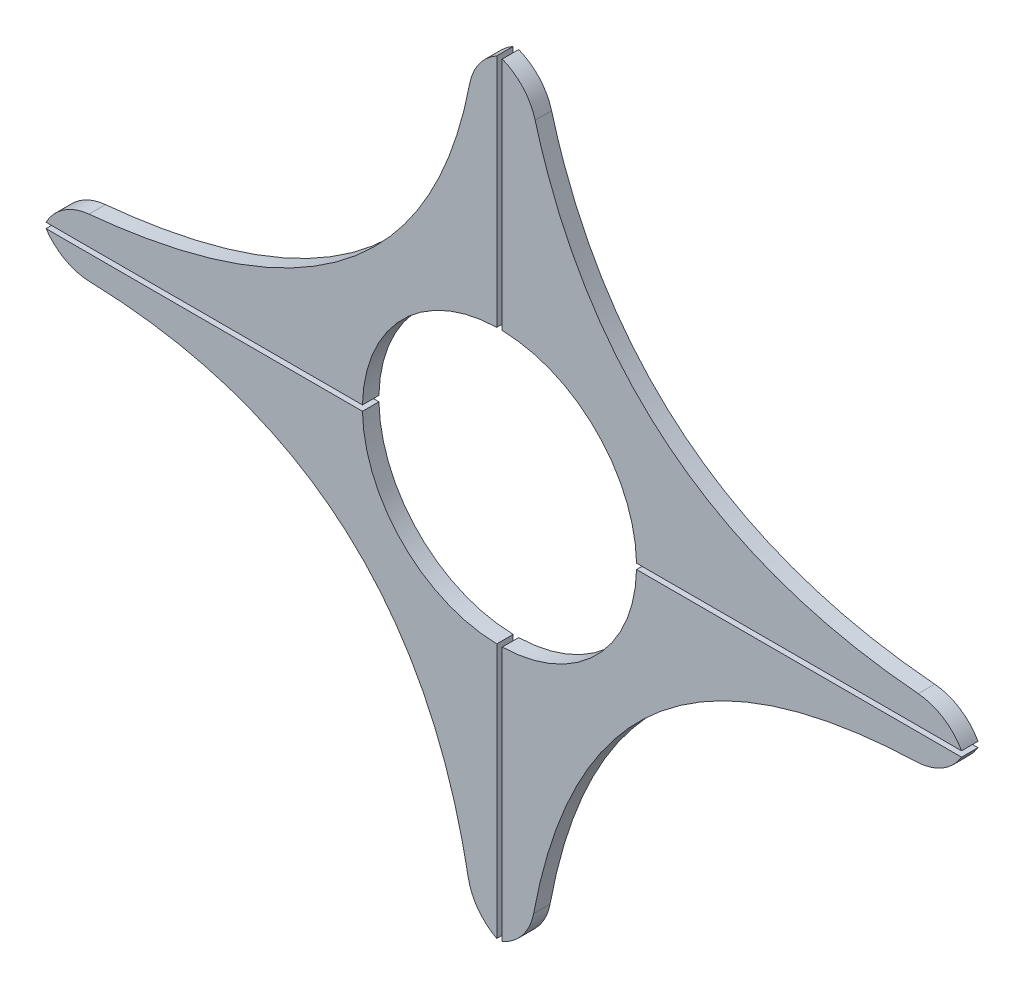
ISO-10303-21;
HEADER;
FILE_DESCRIPTION(('STEP AP214'),'2;1');
FILE_NAME('part.step','',(''),(''),'','','');
FILE_SCHEMA(('AUTOMOTIVE_DESIGN { 1 0 10303 214 1 1 1 1 }'));
ENDSEC;
DATA;
#1=APPLICATION_CONTEXT('core data for automotive mechanical design processes');
#2=APPLICATION_PROTOCOL_DEFINITION('international standard','automotive_design',2000,#1);
#3=PRODUCT_CONTEXT('',#1,'mechanical');
#4=PRODUCT('Part','Part','',(#3));
#5=PRODUCT_RELATED_PRODUCT_CATEGORY('part','',(#4));
#6=PRODUCT_DEFINITION_FORMATION('','',#4);
#7=PRODUCT_DEFINITION_CONTEXT('part definition',#1,'design');
#8=PRODUCT_DEFINITION('design','',#6,#7);
#9=PRODUCT_DEFINITION_SHAPE('','',#8);
#10=(LENGTH_UNIT() NAMED_UNIT(*) SI_UNIT(.MILLI.,.METRE.));
#11=(NAMED_UNIT(*) PLANE_ANGLE_UNIT() SI_UNIT($,.RADIAN.));
#12=(NAMED_UNIT(*) SI_UNIT($,.STERADIAN.) SOLID_ANGLE_UNIT());
#13=UNCERTAINTY_MEASURE_WITH_UNIT(LENGTH_MEASURE(1.E-05),#10,'distance_accuracy_value','');
#14=(GEOMETRIC_REPRESENTATION_CONTEXT(3) GLOBAL_UNCERTAINTY_ASSIGNED_CONTEXT((#13)) GLOBAL_UNIT_ASSIGNED_CONTEXT((#10,
#11,#12)) REPRESENTATION_CONTEXT('',''));
#15=CARTESIAN_POINT('',(0.,0.,0.));
#16=DIRECTION('',(0.,0.,1.));
#17=DIRECTION('',(1.,0.,0.));
#18=AXIS2_PLACEMENT_3D('',#15,#16,#17);
#19=CARTESIAN_POINT('',(0.,0.,3.));
#20=DIRECTION('',(0.,0.,-1.));
#21=DIRECTION('',(-1.,0.,0.));
#22=AXIS2_PLACEMENT_3D('',#19,#20,#21);
#23=PLANE('',#22);
#24=CARTESIAN_POINT('',(-82.7092824955107,-4.92806949824712,3.));
#25=CARTESIAN_POINT('',(-13.547108576695,-2.57847969047096,3.));
#26=CARTESIAN_POINT('',(-4.58970768660391,-71.5253229127844,3.));
#27=B_SPLINE_CURVE_WITH_KNOTS('',2,(#24,#25,#26),.UNSPECIFIED.,.F.,.F.,(3,3),(0.,1.),.UNSPECIFIED.);
#28=CARTESIAN_POINT('',(-74.7083842259428,-4.9004073755603,3.));
#29=VERTEX_POINT('',#28);
#30=CARTESIAN_POINT('',(-5.6943858931049,-64.4920395339686,3.));
#31=VERTEX_POINT('',#30);
#32=EDGE_CURVE('E105',#29,#31,#27,.T.);
#33=ORIENTED_EDGE('',*,*,#32,.T.);
#34=CARTESIAN_POINT('',(4.13740786350712,-62.6656136451231,3.));
#35=DIRECTION('',(0.,0.,-1.));
#36=DIRECTION('',(-1.,0.,0.));
#37=AXIS2_PLACEMENT_3D('',#34,#35,#36);
#38=CIRCLE('',#37,10.);
#39=CARTESIAN_POINT('',(-0.5,-71.5253229127844,3.));
#40=VERTEX_POINT('',#39);
#41=EDGE_CURVE('E12',#31,#40,#38,.F.);
#42=ORIENTED_EDGE('',*,*,#41,.T.);
#43=DIRECTION('',(0.,1.,0.));
#44=VECTOR('',#43,1.);
#45=CARTESIAN_POINT('',(-0.5,-80.8885192781486,3.));
#46=LINE('',#45,#44);
#47=CARTESIAN_POINT('',(-0.5,-24.9949994999,3.));
#48=VERTEX_POINT('',#47);
#49=EDGE_CURVE('E103',#40,#48,#46,.T.);
#50=ORIENTED_EDGE('',*,*,#49,.T.);
#51=CARTESIAN_POINT('',(0.,0.,3.));
#52=DIRECTION('',(0.,0.,1.));
#53=DIRECTION('',(1.,0.,0.));
#54=AXIS2_PLACEMENT_3D('',#51,#52,#53);
#55=CIRCLE('',#54,25.);
#56=CARTESIAN_POINT('',(-24.9949994999,-0.5,3.));
#57=VERTEX_POINT('',#56);
#58=EDGE_CURVE('E139',#57,#48,#55,.T.);
#59=ORIENTED_EDGE('',*,*,#58,.F.);
#60=DIRECTION('',(-1.,0.,0.));
#61=VECTOR('',#60,1.);
#62=CARTESIAN_POINT('',(0.,-0.5,3.));
#63=LINE('',#62,#61);
#64=CARTESIAN_POINT('',(-82.7092824955107,-0.5,3.));
#65=VERTEX_POINT('',#64);
#66=EDGE_CURVE('E114',#57,#65,#63,.T.);
#67=ORIENTED_EDGE('',*,*,#66,.T.);
#68=CARTESIAN_POINT('',(-74.4212968329592,5.09547081641413,3.));
#69=DIRECTION('',(0.,0.,-1.));
#70=DIRECTION('',(-1.,0.,0.));
#71=AXIS2_PLACEMENT_3D('',#68,#69,#70);
#72=CIRCLE('',#71,10.);
#73=EDGE_CURVE('E150',#65,#29,#72,.F.);
#74=ORIENTED_EDGE('',*,*,#73,.T.);
#75=EDGE_LOOP('',(#33,#42,#50,#59,#67,#74));
#76=FACE_BOUND('',#75,.T.);
#77=ADVANCED_FACE('F48',(#76),#23,.F.);
#78=CARTESIAN_POINT('',(0.,0.,0.));
#79=DIRECTION('',(0.,0.,-1.));
#80=DIRECTION('',(-1.,0.,0.));
#81=AXIS2_PLACEMENT_3D('',#78,#79,#80);
#82=PLANE('',#81);
#83=DIRECTION('',(0.,1.,0.));
#84=VECTOR('',#83,1.);
#85=CARTESIAN_POINT('',(-0.5,-80.8885192781486,0.));
#86=LINE('',#85,#84);
#87=CARTESIAN_POINT('',(-0.5,-71.5253229127844,0.));
#88=VERTEX_POINT('',#87);
#89=CARTESIAN_POINT('',(-0.5,-24.9949994999,0.));
#90=VERTEX_POINT('',#89);
#91=EDGE_CURVE('E134',#88,#90,#86,.T.);
#92=ORIENTED_EDGE('',*,*,#91,.F.);
#93=CARTESIAN_POINT('',(4.13740786350712,-62.6656136451231,0.));
#94=DIRECTION('',(0.,0.,-1.));
#95=DIRECTION('',(-1.,0.,0.));
#96=AXIS2_PLACEMENT_3D('',#93,#94,#95);
#97=CIRCLE('',#96,10.);
#98=CARTESIAN_POINT('',(-5.6943858931049,-64.4920395339686,0.));
#99=VERTEX_POINT('',#98);
#100=EDGE_CURVE('E70',#88,#99,#97,.T.);
#101=ORIENTED_EDGE('',*,*,#100,.T.);
#102=CARTESIAN_POINT('',(-82.7092824955107,-4.92806949824712,0.));
#103=CARTESIAN_POINT('',(-13.547108576695,-2.57847969047096,0.));
#104=CARTESIAN_POINT('',(-4.58970768660391,-71.5253229127844,0.));
#105=B_SPLINE_CURVE_WITH_KNOTS('',2,(#102,#103,#104),.UNSPECIFIED.,.F.,.F.,(3,3),(0.,1.),.UNSPECIFIED.);
#106=CARTESIAN_POINT('',(-74.7083842259428,-4.9004073755603,0.));
#107=VERTEX_POINT('',#106);
#108=EDGE_CURVE('E126',#107,#99,#105,.T.);
#109=ORIENTED_EDGE('',*,*,#108,.F.);
#110=CARTESIAN_POINT('',(-74.4212968329592,5.09547081641413,0.));
#111=DIRECTION('',(0.,0.,-1.));
#112=DIRECTION('',(-1.,0.,0.));
#113=AXIS2_PLACEMENT_3D('',#110,#111,#112);
#114=CIRCLE('',#113,10.);
#115=CARTESIAN_POINT('',(-82.7092824955107,-0.5,0.));
#116=VERTEX_POINT('',#115);
#117=EDGE_CURVE('E148',#107,#116,#114,.T.);
#118=ORIENTED_EDGE('',*,*,#117,.T.);
#119=DIRECTION('',(-1.,0.,0.));
#120=VECTOR('',#119,1.);
#121=CARTESIAN_POINT('',(0.,-0.5,0.));
#122=LINE('',#121,#120);
#123=CARTESIAN_POINT('',(-24.9949994999,-0.5,0.));
#124=VERTEX_POINT('',#123);
#125=EDGE_CURVE('E120',#124,#116,#122,.T.);
#126=ORIENTED_EDGE('',*,*,#125,.F.);
#127=CARTESIAN_POINT('',(0.,0.,0.));
#128=DIRECTION('',(0.,0.,1.));
#129=DIRECTION('',(1.,0.,0.));
#130=AXIS2_PLACEMENT_3D('',#127,#128,#129);
#131=CIRCLE('',#130,25.);
#132=EDGE_CURVE('E132',#124,#90,#131,.T.);
#133=ORIENTED_EDGE('',*,*,#132,.T.);
#134=EDGE_LOOP('',(#92,#101,#109,#118,#126,#133));
#135=FACE_BOUND('',#134,.T.);
#136=ADVANCED_FACE('F158',(#135),#82,.T.);
#137=CARTESIAN_POINT('',(0.,0.,0.));
#138=DIRECTION('',(0.,0.,1.));
#139=DIRECTION('',(1.,0.,0.));
#140=AXIS2_PLACEMENT_3D('',#137,#138,#139);
#141=CYLINDRICAL_SURFACE('',#140,25.);
#142=ORIENTED_EDGE('',*,*,#58,.T.);
#143=DIRECTION('',(0.,0.,1.));
#144=VECTOR('',#143,1.);
#145=CARTESIAN_POINT('',(-0.5,-24.9949994999,0.));
#146=LINE('',#145,#144);
#147=EDGE_CURVE('E113',#48,#90,#146,.F.);
#148=ORIENTED_EDGE('',*,*,#147,.T.);
#149=ORIENTED_EDGE('',*,*,#132,.F.);
#150=DIRECTION('',(0.,0.,1.));
#151=VECTOR('',#150,1.);
#152=CARTESIAN_POINT('',(-24.9949994999,-0.5,0.));
#153=LINE('',#152,#151);
#154=EDGE_CURVE('E117',#124,#57,#153,.T.);
#155=ORIENTED_EDGE('',*,*,#154,.T.);
#156=EDGE_LOOP('',(#142,#148,#149,#155));
#157=FACE_BOUND('',#156,.T.);
#158=ADVANCED_FACE('F163',(#157),#141,.F.);
#159=CARTESIAN_POINT('',(0.,-0.5,3.));
#160=DIRECTION('',(0.,-1.,0.));
#161=DIRECTION('',(0.,0.,-1.));
#162=AXIS2_PLACEMENT_3D('',#159,#160,#161);
#163=PLANE('',#162);
#164=ORIENTED_EDGE('',*,*,#125,.T.);
#165=DIRECTION('',(0.,0.,-1.));
#166=VECTOR('',#165,1.);
#167=CARTESIAN_POINT('',(-82.7092824955107,-0.5,3.));
#168=LINE('',#167,#166);
#169=EDGE_CURVE('E116',#65,#116,#168,.T.);
#170=ORIENTED_EDGE('',*,*,#169,.F.);
#171=ORIENTED_EDGE('',*,*,#66,.F.);
#172=ORIENTED_EDGE('',*,*,#154,.F.);
#173=EDGE_LOOP('',(#164,#170,#171,#172));
#174=FACE_BOUND('',#173,.T.);
#175=ADVANCED_FACE('F161',(#174),#163,.F.);
#176=CARTESIAN_POINT('',(-0.5,-80.8885192781486,3.));
#177=DIRECTION('',(-1.,0.,0.));
#178=DIRECTION('',(0.,0.,1.));
#179=AXIS2_PLACEMENT_3D('',#176,#177,#178);
#180=PLANE('',#179);
#181=ORIENTED_EDGE('',*,*,#49,.F.);
#182=DIRECTION('',(0.,0.,1.));
#183=VECTOR('',#182,1.);
#184=CARTESIAN_POINT('',(-0.5,-71.5253229127844,3.));
#185=LINE('',#184,#183);
#186=EDGE_CURVE('E111',#88,#40,#185,.T.);
#187=ORIENTED_EDGE('',*,*,#186,.F.);
#188=ORIENTED_EDGE('',*,*,#91,.T.);
#189=ORIENTED_EDGE('',*,*,#147,.F.);
#190=EDGE_LOOP('',(#181,#187,#188,#189));
#191=FACE_BOUND('',#190,.T.);
#192=ADVANCED_FACE('F110',(#191),#180,.F.);
#193=DIRECTION('',(0.,0.,-1.));
#194=VECTOR('',#193,1.);
#195=SURFACE_OF_LINEAR_EXTRUSION('',#27,#194);
#196=ORIENTED_EDGE('',*,*,#108,.T.);
#197=DIRECTION('',(0.,0.,-1.));
#198=VECTOR('',#197,1.);
#199=CARTESIAN_POINT('',(-5.6943858931049,-64.4920395339686,0.));
#200=LINE('',#199,#198);
#201=EDGE_CURVE('E56',#99,#31,#200,.F.);
#202=ORIENTED_EDGE('',*,*,#201,.T.);
#203=ORIENTED_EDGE('',*,*,#32,.F.);
#204=DIRECTION('',(0.,0.,-1.));
#205=VECTOR('',#204,1.);
#206=CARTESIAN_POINT('',(-74.7083842259427,-4.9004073755603,3.));
#207=LINE('',#206,#205);
#208=EDGE_CURVE('E145',#29,#107,#207,.T.);
#209=ORIENTED_EDGE('',*,*,#208,.T.);
#210=EDGE_LOOP('',(#196,#202,#203,#209));
#211=FACE_BOUND('',#210,.T.);
#212=ADVANCED_FACE('F155',(#211),#195,.F.);
#213=CARTESIAN_POINT('',(-74.4212968329592,5.09547081641413,1.5));
#214=DIRECTION('',(0.,0.,-1.));
#215=DIRECTION('',(-1.,0.,0.));
#216=AXIS2_PLACEMENT_3D('',#213,#214,#215);
#217=CYLINDRICAL_SURFACE('',#216,10.);
#218=ORIENTED_EDGE('',*,*,#73,.F.);
#219=ORIENTED_EDGE('',*,*,#169,.T.);
#220=ORIENTED_EDGE('',*,*,#117,.F.);
#221=ORIENTED_EDGE('',*,*,#208,.F.);
#222=EDGE_LOOP('',(#218,#219,#220,#221));
#223=FACE_BOUND('',#222,.T.);
#224=ADVANCED_FACE('F156',(#223),#217,.T.);
#225=CARTESIAN_POINT('',(4.13740786350712,-62.6656136451231,1.5));
#226=DIRECTION('',(0.,0.,-1.));
#227=DIRECTION('',(-1.,0.,0.));
#228=AXIS2_PLACEMENT_3D('',#225,#226,#227);
#229=CYLINDRICAL_SURFACE('',#228,10.);
#230=ORIENTED_EDGE('',*,*,#41,.F.);
#231=ORIENTED_EDGE('',*,*,#201,.F.);
#232=ORIENTED_EDGE('',*,*,#100,.F.);
#233=ORIENTED_EDGE('',*,*,#186,.T.);
#234=EDGE_LOOP('',(#230,#231,#232,#233));
#235=FACE_BOUND('',#234,.T.);
#236=ADVANCED_FACE('F50',(#235),#229,.T.);
#237=CLOSED_SHELL('',(#77,#136,#158,#175,#192,#212,#224,#236));
#238=MANIFOLD_SOLID_BREP('B2',#237);
#239=CARTESIAN_POINT('',(24.9949994999,-0.5,0.));
#240=DIRECTION('',(0.,-1.,0.));
#241=DIRECTION('',(1.,0.,0.));
#242=AXIS2_PLACEMENT_3D('',#239,#240,#241);
#243=PLANE('',#242);
#244=DIRECTION('',(1.,0.,0.));
#245=VECTOR('',#244,1.);
#246=CARTESIAN_POINT('',(24.9949994999,-0.5,3.));
#247=LINE('',#246,#245);
#248=CARTESIAN_POINT('',(24.9949994999,-0.5,3.));
#249=VERTEX_POINT('',#248);
#250=CARTESIAN_POINT('',(84.269834995426,-0.5,3.));
#251=VERTEX_POINT('',#250);
#252=EDGE_CURVE('E340',#249,#251,#247,.T.);
#253=ORIENTED_EDGE('',*,*,#252,.T.);
#254=DIRECTION('',(0.,0.,1.));
#255=VECTOR('',#254,1.);
#256=CARTESIAN_POINT('',(84.269834995426,-0.5,0.));
#257=LINE('',#256,#255);
#258=CARTESIAN_POINT('',(84.269834995426,-0.5,0.));
#259=VERTEX_POINT('',#258);
#260=EDGE_CURVE('E343',#259,#251,#257,.T.);
#261=ORIENTED_EDGE('',*,*,#260,.F.);
#262=DIRECTION('',(1.,0.,0.));
#263=VECTOR('',#262,1.);
#264=CARTESIAN_POINT('',(24.9949994999,-0.5,0.));
#265=LINE('',#264,#263);
#266=CARTESIAN_POINT('',(24.9949994999,-0.500000000000074,0.));
#267=VERTEX_POINT('',#266);
#268=EDGE_CURVE('E323',#267,#259,#265,.T.);
#269=ORIENTED_EDGE('',*,*,#268,.F.);
#270=DIRECTION('',(0.,0.,1.));
#271=VECTOR('',#270,1.);
#272=CARTESIAN_POINT('',(24.9949994999,-0.5,0.));
#273=LINE('',#272,#271);
#274=EDGE_CURVE('E322',#267,#249,#273,.T.);
#275=ORIENTED_EDGE('',*,*,#274,.T.);
#276=EDGE_LOOP('',(#253,#261,#269,#275));
#277=FACE_BOUND('',#276,.T.);
#278=ADVANCED_FACE('F249',(#277),#243,.F.);
#279=CARTESIAN_POINT('',(0.,0.,0.));
#280=DIRECTION('',(0.,0.,1.));
#281=DIRECTION('',(1.,0.,0.));
#282=AXIS2_PLACEMENT_3D('',#279,#280,#281);
#283=CYLINDRICAL_SURFACE('',#282,25.);
#284=CARTESIAN_POINT('',(0.,0.,0.));
#285=DIRECTION('',(0.,0.,1.));
#286=DIRECTION('',(1.,0.,0.));
#287=AXIS2_PLACEMENT_3D('',#284,#285,#286);
#288=CIRCLE('',#287,25.);
#289=CARTESIAN_POINT('',(0.499999999999997,-24.9949994999,0.));
#290=VERTEX_POINT('',#289);
#291=EDGE_CURVE('E312',#290,#267,#288,.T.);
#292=ORIENTED_EDGE('',*,*,#291,.F.);
#293=DIRECTION('',(0.,0.,1.));
#294=VECTOR('',#293,1.);
#295=CARTESIAN_POINT('',(0.499999999999997,-24.9949994999,0.));
#296=LINE('',#295,#294);
#297=CARTESIAN_POINT('',(0.499999999999997,-24.9949994999,3.));
#298=VERTEX_POINT('',#297);
#299=EDGE_CURVE('E302',#290,#298,#296,.T.);
#300=ORIENTED_EDGE('',*,*,#299,.T.);
#301=CARTESIAN_POINT('',(0.,0.,3.));
#302=DIRECTION('',(0.,0.,1.));
#303=DIRECTION('',(1.,0.,0.));
#304=AXIS2_PLACEMENT_3D('',#301,#302,#303);
#305=CIRCLE('',#304,25.);
#306=EDGE_CURVE('E325',#298,#249,#305,.T.);
#307=ORIENTED_EDGE('',*,*,#306,.T.);
#308=ORIENTED_EDGE('',*,*,#274,.F.);
#309=EDGE_LOOP('',(#292,#300,#307,#308));
#310=FACE_BOUND('',#309,.T.);
#311=ADVANCED_FACE('F320',(#310),#283,.F.);
#312=CARTESIAN_POINT('',(0.,0.,0.));
#313=DIRECTION('',(0.,0.,-1.));
#314=DIRECTION('',(-1.,0.,0.));
#315=AXIS2_PLACEMENT_3D('',#312,#313,#314);
#316=PLANE('',#315);
#317=ORIENTED_EDGE('',*,*,#268,.T.);
#318=CARTESIAN_POINT('',(75.6950934816593,4.64527044693371,0.));
#319=DIRECTION('',(0.,0.,-1.));
#320=DIRECTION('',(-1.,0.,0.));
#321=AXIS2_PLACEMENT_3D('',#318,#319,#320);
#322=CIRCLE('',#321,10.);
#323=CARTESIAN_POINT('',(76.0302979673029,-5.3491098716656,0.));
#324=VERTEX_POINT('',#323);
#325=EDGE_CURVE('E271',#259,#324,#322,.T.);
#326=ORIENTED_EDGE('',*,*,#325,.T.);
#327=CARTESIAN_POINT('',(5.09505954304754,-71.5253229127844,0.));
#328=CARTESIAN_POINT('',(13.6112955337211,-3.3789517058772,0.));
#329=CARTESIAN_POINT('',(84.269834995426,-5.33160146614925,0.));
#330=B_SPLINE_CURVE_WITH_KNOTS('',2,(#327,#328,#329),.UNSPECIFIED.,.F.,.F.,(3,3),(0.,1.),.UNSPECIFIED.);
#331=CARTESIAN_POINT('',(6.22098603170053,-64.2350231153593,0.));
#332=VERTEX_POINT('',#331);
#333=EDGE_CURVE('E350',#332,#324,#330,.T.);
#334=ORIENTED_EDGE('',*,*,#333,.F.);
#335=CARTESIAN_POINT('',(-3.61095700379703,-62.4094009894168,0.));
#336=DIRECTION('',(0.,0.,-1.));
#337=DIRECTION('',(-1.,0.,0.));
#338=AXIS2_PLACEMENT_3D('',#335,#336,#337);
#339=CIRCLE('',#338,10.);
#340=CARTESIAN_POINT('',(0.5,-71.5253229127844,0.));
#341=VERTEX_POINT('',#340);
#342=EDGE_CURVE('E316',#332,#341,#339,.T.);
#343=ORIENTED_EDGE('',*,*,#342,.T.);
#344=DIRECTION('',(0.,-1.,0.));
#345=VECTOR('',#344,1.);
#346=CARTESIAN_POINT('',(0.5,0.,0.));
#347=LINE('',#346,#345);
#348=EDGE_CURVE('E305',#290,#341,#347,.T.);
#349=ORIENTED_EDGE('',*,*,#348,.F.);
#350=ORIENTED_EDGE('',*,*,#291,.T.);
#351=EDGE_LOOP('',(#317,#326,#334,#343,#349,#350));
#352=FACE_BOUND('',#351,.T.);
#353=ADVANCED_FACE('F314',(#352),#316,.T.);
#354=CARTESIAN_POINT('',(0.,0.,3.));
#355=DIRECTION('',(0.,0.,-1.));
#356=DIRECTION('',(-1.,0.,0.));
#357=AXIS2_PLACEMENT_3D('',#354,#355,#356);
#358=PLANE('',#357);
#359=CARTESIAN_POINT('',(5.09505954304754,-71.5253229127844,3.));
#360=CARTESIAN_POINT('',(13.6112955337211,-3.3789517058772,3.));
#361=CARTESIAN_POINT('',(84.269834995426,-5.33160146614925,3.));
#362=B_SPLINE_CURVE_WITH_KNOTS('',2,(#359,#360,#361),.UNSPECIFIED.,.F.,.F.,(3,3),(0.,1.),.UNSPECIFIED.);
#363=CARTESIAN_POINT('',(6.22098603170053,-64.2350231153593,3.));
#364=VERTEX_POINT('',#363);
#365=CARTESIAN_POINT('',(76.0302979673029,-5.3491098716656,3.));
#366=VERTEX_POINT('',#365);
#367=EDGE_CURVE('E317',#364,#366,#362,.T.);
#368=ORIENTED_EDGE('',*,*,#367,.T.);
#369=CARTESIAN_POINT('',(75.6950934816593,4.64527044693371,3.));
#370=DIRECTION('',(0.,0.,-1.));
#371=DIRECTION('',(-1.,0.,0.));
#372=AXIS2_PLACEMENT_3D('',#369,#370,#371);
#373=CIRCLE('',#372,10.);
#374=EDGE_CURVE('E46',#366,#251,#373,.F.);
#375=ORIENTED_EDGE('',*,*,#374,.T.);
#376=ORIENTED_EDGE('',*,*,#252,.F.);
#377=ORIENTED_EDGE('',*,*,#306,.F.);
#378=DIRECTION('',(0.,-1.,0.));
#379=VECTOR('',#378,1.);
#380=CARTESIAN_POINT('',(0.5,0.,3.));
#381=LINE('',#380,#379);
#382=CARTESIAN_POINT('',(0.499999999999991,-71.5253229127844,3.));
#383=VERTEX_POINT('',#382);
#384=EDGE_CURVE('E308',#298,#383,#381,.T.);
#385=ORIENTED_EDGE('',*,*,#384,.T.);
#386=CARTESIAN_POINT('',(-3.61095700379703,-62.4094009894168,3.));
#387=DIRECTION('',(0.,0.,-1.));
#388=DIRECTION('',(-1.,0.,0.));
#389=AXIS2_PLACEMENT_3D('',#386,#387,#388);
#390=CIRCLE('',#389,10.);
#391=EDGE_CURVE('E388',#383,#364,#390,.F.);
#392=ORIENTED_EDGE('',*,*,#391,.T.);
#393=EDGE_LOOP('',(#368,#375,#376,#377,#385,#392));
#394=FACE_BOUND('',#393,.T.);
#395=ADVANCED_FACE('F370',(#394),#358,.F.);
#396=CARTESIAN_POINT('',(0.5,0.,3.));
#397=DIRECTION('',(1.,0.,0.));
#398=DIRECTION('',(0.,1.,0.));
#399=AXIS2_PLACEMENT_3D('',#396,#397,#398);
#400=PLANE('',#399);
#401=ORIENTED_EDGE('',*,*,#348,.T.);
#402=DIRECTION('',(0.,0.,-1.));
#403=VECTOR('',#402,1.);
#404=CARTESIAN_POINT('',(0.499999999999987,-71.5253229127844,3.));
#405=LINE('',#404,#403);
#406=EDGE_CURVE('E330',#383,#341,#405,.T.);
#407=ORIENTED_EDGE('',*,*,#406,.F.);
#408=ORIENTED_EDGE('',*,*,#384,.F.);
#409=ORIENTED_EDGE('',*,*,#299,.F.);
#410=EDGE_LOOP('',(#401,#407,#408,#409));
#411=FACE_BOUND('',#410,.T.);
#412=ADVANCED_FACE('F304',(#411),#400,.F.);
#413=DIRECTION('',(0.,0.,-1.));
#414=VECTOR('',#413,1.);
#415=SURFACE_OF_LINEAR_EXTRUSION('',#362,#414);
#416=ORIENTED_EDGE('',*,*,#333,.T.);
#417=DIRECTION('',(0.,0.,-1.));
#418=VECTOR('',#417,1.);
#419=CARTESIAN_POINT('',(76.0302979673029,-5.3491098716656,0.));
#420=LINE('',#419,#418);
#421=EDGE_CURVE('E257',#324,#366,#420,.F.);
#422=ORIENTED_EDGE('',*,*,#421,.T.);
#423=ORIENTED_EDGE('',*,*,#367,.F.);
#424=DIRECTION('',(0.,0.,-1.));
#425=VECTOR('',#424,1.);
#426=CARTESIAN_POINT('',(6.22098603170053,-64.2350231153593,3.));
#427=LINE('',#426,#425);
#428=EDGE_CURVE('E390',#364,#332,#427,.T.);
#429=ORIENTED_EDGE('',*,*,#428,.T.);
#430=EDGE_LOOP('',(#416,#422,#423,#429));
#431=FACE_BOUND('',#430,.T.);
#432=ADVANCED_FACE('F364',(#431),#415,.F.);
#433=CARTESIAN_POINT('',(-3.61095700379703,-62.4094009894168,1.5));
#434=DIRECTION('',(0.,0.,-1.));
#435=DIRECTION('',(-1.,0.,0.));
#436=AXIS2_PLACEMENT_3D('',#433,#434,#435);
#437=CYLINDRICAL_SURFACE('',#436,10.);
#438=ORIENTED_EDGE('',*,*,#391,.F.);
#439=ORIENTED_EDGE('',*,*,#406,.T.);
#440=ORIENTED_EDGE('',*,*,#342,.F.);
#441=ORIENTED_EDGE('',*,*,#428,.F.);
#442=EDGE_LOOP('',(#438,#439,#440,#441));
#443=FACE_BOUND('',#442,.T.);
#444=ADVANCED_FACE('F367',(#443),#437,.T.);
#445=CARTESIAN_POINT('',(75.6950934816593,4.64527044693371,1.5));
#446=DIRECTION('',(0.,0.,-1.));
#447=DIRECTION('',(-1.,0.,0.));
#448=AXIS2_PLACEMENT_3D('',#445,#446,#447);
#449=CYLINDRICAL_SURFACE('',#448,10.);
#450=ORIENTED_EDGE('',*,*,#374,.F.);
#451=ORIENTED_EDGE('',*,*,#421,.F.);
#452=ORIENTED_EDGE('',*,*,#325,.F.);
#453=ORIENTED_EDGE('',*,*,#260,.T.);
#454=EDGE_LOOP('',(#450,#451,#452,#453));
#455=FACE_BOUND('',#454,.T.);
#456=ADVANCED_FACE('F251',(#455),#449,.T.);
#457=CLOSED_SHELL('',(#278,#311,#353,#395,#412,#432,#444,#456));
#458=MANIFOLD_SOLID_BREP('B6',#457);
#459=CARTESIAN_POINT('',(-0.5,0.,0.));
#460=DIRECTION('',(-1.,0.,0.));
#461=DIRECTION('',(0.,0.,1.));
#462=AXIS2_PLACEMENT_3D('',#459,#460,#461);
#463=PLANE('',#462);
#464=DIRECTION('',(0.,0.,1.));
#465=VECTOR('',#464,1.);
#466=CARTESIAN_POINT('',(-0.5,67.8840337463154,3.));
#467=LINE('',#466,#465);
#468=CARTESIAN_POINT('',(-0.5,67.8840337463154,0.));
#469=VERTEX_POINT('',#468);
#470=CARTESIAN_POINT('',(-0.5,67.8840337463154,3.));
#471=VERTEX_POINT('',#470);
#472=EDGE_CURVE('E544',#469,#471,#467,.T.);
#473=ORIENTED_EDGE('',*,*,#472,.T.);
#474=DIRECTION('',(0.,-1.,0.));
#475=VECTOR('',#474,1.);
#476=CARTESIAN_POINT('',(-0.5,0.,3.));
#477=LINE('',#476,#475);
#478=CARTESIAN_POINT('',(-0.5,24.9949994999,3.));
#479=VERTEX_POINT('',#478);
#480=EDGE_CURVE('E520',#471,#479,#477,.T.);
#481=ORIENTED_EDGE('',*,*,#480,.T.);
#482=DIRECTION('',(0.,0.,1.));
#483=VECTOR('',#482,1.);
#484=CARTESIAN_POINT('',(-0.5,24.9949994999,0.));
#485=LINE('',#484,#483);
#486=CARTESIAN_POINT('',(-0.5,24.9949994999,0.));
#487=VERTEX_POINT('',#486);
#488=EDGE_CURVE('E537',#487,#479,#485,.T.);
#489=ORIENTED_EDGE('',*,*,#488,.F.);
#490=DIRECTION('',(0.,-1.,0.));
#491=VECTOR('',#490,1.);
#492=CARTESIAN_POINT('',(-0.5,0.,0.));
#493=LINE('',#492,#491);
#494=EDGE_CURVE('E536',#469,#487,#493,.T.);
#495=ORIENTED_EDGE('',*,*,#494,.F.);
#496=EDGE_LOOP('',(#473,#481,#489,#495));
#497=FACE_BOUND('',#496,.T.);
#498=ADVANCED_FACE('F455',(#497),#463,.F.);
#499=CARTESIAN_POINT('',(0.,0.,0.));
#500=DIRECTION('',(0.,0.,1.));
#501=DIRECTION('',(1.,0.,0.));
#502=AXIS2_PLACEMENT_3D('',#499,#500,#501);
#503=CYLINDRICAL_SURFACE('',#502,25.);
#504=CARTESIAN_POINT('',(0.,0.,3.));
#505=DIRECTION('',(0.,0.,1.));
#506=DIRECTION('',(1.,0.,0.));
#507=AXIS2_PLACEMENT_3D('',#504,#505,#506);
#508=CIRCLE('',#507,25.);
#509=CARTESIAN_POINT('',(-24.9949994999,0.500000000000003,3.));
#510=VERTEX_POINT('',#509);
#511=EDGE_CURVE('E540',#479,#510,#508,.T.);
#512=ORIENTED_EDGE('',*,*,#511,.T.);
#513=DIRECTION('',(0.,0.,1.));
#514=VECTOR('',#513,1.);
#515=CARTESIAN_POINT('',(-24.9949994999,0.500000000000003,0.));
#516=LINE('',#515,#514);
#517=CARTESIAN_POINT('',(-24.9949994999,0.500000000000003,0.));
#518=VERTEX_POINT('',#517);
#519=EDGE_CURVE('E529',#510,#518,#516,.F.);
#520=ORIENTED_EDGE('',*,*,#519,.T.);
#521=CARTESIAN_POINT('',(0.,0.,0.));
#522=DIRECTION('',(0.,0.,1.));
#523=DIRECTION('',(1.,0.,0.));
#524=AXIS2_PLACEMENT_3D('',#521,#522,#523);
#525=CIRCLE('',#524,25.);
#526=EDGE_CURVE('E526',#487,#518,#525,.T.);
#527=ORIENTED_EDGE('',*,*,#526,.F.);
#528=ORIENTED_EDGE('',*,*,#488,.T.);
#529=EDGE_LOOP('',(#512,#520,#527,#528));
#530=FACE_BOUND('',#529,.T.);
#531=ADVANCED_FACE('F569',(#530),#503,.F.);
#532=CARTESIAN_POINT('',(0.,0.,0.));
#533=DIRECTION('',(0.,0.,-1.));
#534=DIRECTION('',(-1.,0.,0.));
#535=AXIS2_PLACEMENT_3D('',#532,#533,#534);
#536=PLANE('',#535);
#537=DIRECTION('',(1.,0.,0.));
#538=VECTOR('',#537,1.);
#539=CARTESIAN_POINT('',(-89.2447695483154,0.500000000000011,0.));
#540=LINE('',#539,#538);
#541=CARTESIAN_POINT('',(-82.7092824955107,0.50000000000001,0.));
#542=VERTEX_POINT('',#541);
#543=EDGE_CURVE('E515',#542,#518,#540,.T.);
#544=ORIENTED_EDGE('',*,*,#543,.F.);
#545=CARTESIAN_POINT('',(-73.90694669568,-4.24540667035199,0.));
#546=DIRECTION('',(0.,0.,-1.));
#547=DIRECTION('',(-1.,0.,0.));
#548=AXIS2_PLACEMENT_3D('',#545,#546,#547);
#549=CIRCLE('',#548,10.);
#550=CARTESIAN_POINT('',(-74.8546883148296,5.70958131674937,0.));
#551=VERTEX_POINT('',#550);
#552=EDGE_CURVE('E477',#542,#551,#549,.T.);
#553=ORIENTED_EDGE('',*,*,#552,.T.);
#554=CARTESIAN_POINT('',(-4.38794170265283,67.8840337463154,0.));
#555=CARTESIAN_POINT('',(-11.3012470281209,8.44252407266751,0.));
#556=CARTESIAN_POINT('',(-82.7092824955107,5.16022969930648,0.));
#557=B_SPLINE_CURVE_WITH_KNOTS('',2,(#554,#555,#556),.UNSPECIFIED.,.F.,.F.,(3,3),(0.,1.),.UNSPECIFIED.);
#558=CARTESIAN_POINT('',(-5.43323210135808,61.0391900813293,0.));
#559=VERTEX_POINT('',#558);
#560=EDGE_CURVE('E531',#559,#551,#557,.T.);
#561=ORIENTED_EDGE('',*,*,#560,.F.);
#562=CARTESIAN_POINT('',(4.38870287042773,59.1604688646473,0.));
#563=DIRECTION('',(0.,0.,-1.));
#564=DIRECTION('',(-1.,0.,0.));
#565=AXIS2_PLACEMENT_3D('',#562,#563,#564);
#566=CIRCLE('',#565,10.);
#567=EDGE_CURVE('E553',#559,#469,#566,.T.);
#568=ORIENTED_EDGE('',*,*,#567,.T.);
#569=ORIENTED_EDGE('',*,*,#494,.T.);
#570=ORIENTED_EDGE('',*,*,#526,.T.);
#571=EDGE_LOOP('',(#544,#553,#561,#568,#569,#570));
#572=FACE_BOUND('',#571,.T.);
#573=ADVANCED_FACE('F523',(#572),#536,.T.);
#574=CARTESIAN_POINT('',(0.,0.,3.));
#575=DIRECTION('',(0.,0.,-1.));
#576=DIRECTION('',(-1.,0.,0.));
#577=AXIS2_PLACEMENT_3D('',#574,#575,#576);
#578=PLANE('',#577);
#579=CARTESIAN_POINT('',(-4.38794170265283,67.8840337463154,3.));
#580=CARTESIAN_POINT('',(-11.3012470281209,8.44252407266751,3.));
#581=CARTESIAN_POINT('',(-82.7092824955107,5.16022969930648,3.));
#582=B_SPLINE_CURVE_WITH_KNOTS('',2,(#579,#580,#581),.UNSPECIFIED.,.F.,.F.,(3,3),(0.,1.),.UNSPECIFIED.);
#583=CARTESIAN_POINT('',(-5.43323210135808,61.0391900813293,3.));
#584=VERTEX_POINT('',#583);
#585=CARTESIAN_POINT('',(-74.8546883148297,5.70958131674936,3.));
#586=VERTEX_POINT('',#585);
#587=EDGE_CURVE('E527',#584,#586,#582,.T.);
#588=ORIENTED_EDGE('',*,*,#587,.T.);
#589=CARTESIAN_POINT('',(-73.90694669568,-4.24540667035199,3.));
#590=DIRECTION('',(0.,0.,-1.));
#591=DIRECTION('',(-1.,0.,0.));
#592=AXIS2_PLACEMENT_3D('',#589,#590,#591);
#593=CIRCLE('',#592,10.);
#594=CARTESIAN_POINT('',(-82.7092824955107,0.500000000000014,3.));
#595=VERTEX_POINT('',#594);
#596=EDGE_CURVE('E247',#586,#595,#593,.F.);
#597=ORIENTED_EDGE('',*,*,#596,.T.);
#598=DIRECTION('',(1.,0.,0.));
#599=VECTOR('',#598,1.);
#600=CARTESIAN_POINT('',(-89.2447695483154,0.500000000000011,3.));
#601=LINE('',#600,#599);
#602=EDGE_CURVE('E518',#595,#510,#601,.T.);
#603=ORIENTED_EDGE('',*,*,#602,.T.);
#604=ORIENTED_EDGE('',*,*,#511,.F.);
#605=ORIENTED_EDGE('',*,*,#480,.F.);
#606=CARTESIAN_POINT('',(4.38870287042773,59.1604688646473,3.));
#607=DIRECTION('',(0.,0.,-1.));
#608=DIRECTION('',(-1.,0.,0.));
#609=AXIS2_PLACEMENT_3D('',#606,#607,#608);
#610=CIRCLE('',#609,10.);
#611=EDGE_CURVE('E510',#471,#584,#610,.F.);
#612=ORIENTED_EDGE('',*,*,#611,.T.);
#613=EDGE_LOOP('',(#588,#597,#603,#604,#605,#612));
#614=FACE_BOUND('',#613,.T.);
#615=ADVANCED_FACE('F558',(#614),#578,.F.);
#616=CARTESIAN_POINT('',(-89.2447695483154,0.500000000000011,3.));
#617=DIRECTION('',(0.,1.,0.));
#618=DIRECTION('',(-1.,0.,0.));
#619=AXIS2_PLACEMENT_3D('',#616,#617,#618);
#620=PLANE('',#619);
#621=ORIENTED_EDGE('',*,*,#602,.F.);
#622=DIRECTION('',(0.,0.,1.));
#623=VECTOR('',#622,1.);
#624=CARTESIAN_POINT('',(-82.7092824955107,0.500000000000014,3.));
#625=LINE('',#624,#623);
#626=EDGE_CURVE('E509',#542,#595,#625,.T.);
#627=ORIENTED_EDGE('',*,*,#626,.F.);
#628=ORIENTED_EDGE('',*,*,#543,.T.);
#629=ORIENTED_EDGE('',*,*,#519,.F.);
#630=EDGE_LOOP('',(#621,#627,#628,#629));
#631=FACE_BOUND('',#630,.T.);
#632=ADVANCED_FACE('F514',(#631),#620,.F.);
#633=DIRECTION('',(0.,0.,-1.));
#634=VECTOR('',#633,1.);
#635=SURFACE_OF_LINEAR_EXTRUSION('',#582,#634);
#636=ORIENTED_EDGE('',*,*,#560,.T.);
#637=DIRECTION('',(0.,0.,-1.));
#638=VECTOR('',#637,1.);
#639=CARTESIAN_POINT('',(-74.8546883148296,5.70958131674936,0.));
#640=LINE('',#639,#638);
#641=EDGE_CURVE('E463',#551,#586,#640,.F.);
#642=ORIENTED_EDGE('',*,*,#641,.T.);
#643=ORIENTED_EDGE('',*,*,#587,.F.);
#644=DIRECTION('',(0.,0.,-1.));
#645=VECTOR('',#644,1.);
#646=CARTESIAN_POINT('',(-5.43323210135808,61.0391900813293,3.));
#647=LINE('',#646,#645);
#648=EDGE_CURVE('E519',#584,#559,#647,.T.);
#649=ORIENTED_EDGE('',*,*,#648,.T.);
#650=EDGE_LOOP('',(#636,#642,#643,#649));
#651=FACE_BOUND('',#650,.T.);
#652=ADVANCED_FACE('F563',(#651),#635,.F.);
#653=CARTESIAN_POINT('',(4.38870287042773,59.1604688646473,1.5));
#654=DIRECTION('',(0.,0.,-1.));
#655=DIRECTION('',(-1.,0.,0.));
#656=AXIS2_PLACEMENT_3D('',#653,#654,#655);
#657=CYLINDRICAL_SURFACE('',#656,10.);
#658=ORIENTED_EDGE('',*,*,#611,.F.);
#659=ORIENTED_EDGE('',*,*,#472,.F.);
#660=ORIENTED_EDGE('',*,*,#567,.F.);
#661=ORIENTED_EDGE('',*,*,#648,.F.);
#662=EDGE_LOOP('',(#658,#659,#660,#661));
#663=FACE_BOUND('',#662,.T.);
#664=ADVANCED_FACE('F564',(#663),#657,.T.);
#665=CARTESIAN_POINT('',(-73.90694669568,-4.24540667035199,1.5));
#666=DIRECTION('',(0.,0.,-1.));
#667=DIRECTION('',(-1.,0.,0.));
#668=AXIS2_PLACEMENT_3D('',#665,#666,#667);
#669=CYLINDRICAL_SURFACE('',#668,10.);
#670=ORIENTED_EDGE('',*,*,#596,.F.);
#671=ORIENTED_EDGE('',*,*,#641,.F.);
#672=ORIENTED_EDGE('',*,*,#552,.F.);
#673=ORIENTED_EDGE('',*,*,#626,.T.);
#674=EDGE_LOOP('',(#670,#671,#672,#673));
#675=FACE_BOUND('',#674,.T.);
#676=ADVANCED_FACE('F457',(#675),#669,.T.);
#677=CLOSED_SHELL('',(#498,#531,#573,#615,#632,#652,#664,#676));
#678=MANIFOLD_SOLID_BREP('B40',#677);
#679=CARTESIAN_POINT('',(84.269834995426,0.5,0.));
#680=DIRECTION('',(0.,1.,0.));
#681=DIRECTION('',(-1.,0.,0.));
#682=AXIS2_PLACEMENT_3D('',#679,#680,#681);
#683=PLANE('',#682);
#684=DIRECTION('',(-1.,0.,0.));
#685=VECTOR('',#684,1.);
#686=CARTESIAN_POINT('',(84.269834995426,0.5,3.));
#687=LINE('',#686,#685);
#688=CARTESIAN_POINT('',(84.269834995426,0.5,3.));
#689=VERTEX_POINT('',#688);
#690=CARTESIAN_POINT('',(24.9949994999,0.499999999999992,3.));
#691=VERTEX_POINT('',#690);
#692=EDGE_CURVE('E738',#689,#691,#687,.T.);
#693=ORIENTED_EDGE('',*,*,#692,.T.);
#694=DIRECTION('',(0.,0.,1.));
#695=VECTOR('',#694,1.);
#696=CARTESIAN_POINT('',(24.9949994999,0.499999999999993,0.));
#697=LINE('',#696,#695);
#698=CARTESIAN_POINT('',(24.9949994999,0.499999999999993,0.));
#699=VERTEX_POINT('',#698);
#700=EDGE_CURVE('E722',#699,#691,#697,.T.);
#701=ORIENTED_EDGE('',*,*,#700,.F.);
#702=DIRECTION('',(-1.,0.,0.));
#703=VECTOR('',#702,1.);
#704=CARTESIAN_POINT('',(84.269834995426,0.5,0.));
#705=LINE('',#704,#703);
#706=CARTESIAN_POINT('',(84.269834995426,0.5,0.));
#707=VERTEX_POINT('',#706);
#708=EDGE_CURVE('E735',#707,#699,#705,.T.);
#709=ORIENTED_EDGE('',*,*,#708,.F.);
#710=DIRECTION('',(0.,0.,1.));
#711=VECTOR('',#710,1.);
#712=CARTESIAN_POINT('',(84.269834995426,0.5,0.));
#713=LINE('',#712,#711);
#714=EDGE_CURVE('E725',#707,#689,#713,.T.);
#715=ORIENTED_EDGE('',*,*,#714,.T.);
#716=EDGE_LOOP('',(#693,#701,#709,#715));
#717=FACE_BOUND('',#716,.T.);
#718=ADVANCED_FACE('F646',(#717),#683,.F.);
#719=CARTESIAN_POINT('',(0.,0.,0.));
#720=DIRECTION('',(0.,0.,1.));
#721=DIRECTION('',(1.,0.,0.));
#722=AXIS2_PLACEMENT_3D('',#719,#720,#721);
#723=CYLINDRICAL_SURFACE('',#722,25.);
#724=CARTESIAN_POINT('',(0.,0.,3.));
#725=DIRECTION('',(0.,0.,1.));
#726=DIRECTION('',(1.,0.,0.));
#727=AXIS2_PLACEMENT_3D('',#724,#725,#726);
#728=CIRCLE('',#727,25.);
#729=CARTESIAN_POINT('',(0.5,24.9949994999,3.));
#730=VERTEX_POINT('',#729);
#731=EDGE_CURVE('E715',#691,#730,#728,.T.);
#732=ORIENTED_EDGE('',*,*,#731,.T.);
#733=DIRECTION('',(0.,0.,1.));
#734=VECTOR('',#733,1.);
#735=CARTESIAN_POINT('',(0.5,24.9949994999,0.));
#736=LINE('',#735,#734);
#737=CARTESIAN_POINT('',(0.5,24.9949994999,0.));
#738=VERTEX_POINT('',#737);
#739=EDGE_CURVE('E698',#730,#738,#736,.F.);
#740=ORIENTED_EDGE('',*,*,#739,.T.);
#741=CARTESIAN_POINT('',(0.,0.,0.));
#742=DIRECTION('',(0.,0.,1.));
#743=DIRECTION('',(1.,0.,0.));
#744=AXIS2_PLACEMENT_3D('',#741,#742,#743);
#745=CIRCLE('',#744,25.);
#746=EDGE_CURVE('E711',#699,#738,#745,.T.);
#747=ORIENTED_EDGE('',*,*,#746,.F.);
#748=ORIENTED_EDGE('',*,*,#700,.T.);
#749=EDGE_LOOP('',(#732,#740,#747,#748));
#750=FACE_BOUND('',#749,.T.);
#751=ADVANCED_FACE('F721',(#750),#723,.F.);
#752=CARTESIAN_POINT('',(0.,0.,0.));
#753=DIRECTION('',(0.,0.,-1.));
#754=DIRECTION('',(-1.,0.,0.));
#755=AXIS2_PLACEMENT_3D('',#752,#753,#754);
#756=PLANE('',#755);
#757=CARTESIAN_POINT('',(84.269834995426,5.16022969930648,0.));
#758=CARTESIAN_POINT('',(17.7213064535339,6.82187209181612,0.));
#759=CARTESIAN_POINT('',(4.89329355909646,67.8840337463154,0.));
#760=B_SPLINE_CURVE_WITH_KNOTS('',2,(#757,#758,#759),.UNSPECIFIED.,.F.,.F.,(3,3),(0.,1.),.UNSPECIFIED.);
#761=CARTESIAN_POINT('',(76.3738760914871,5.58205469471382,0.));
#762=VERTEX_POINT('',#761);
#763=CARTESIAN_POINT('',(6.50243961065623,61.2169873839631,0.));
#764=VERTEX_POINT('',#763);
#765=EDGE_CURVE('E748',#762,#764,#760,.T.);
#766=ORIENTED_EDGE('',*,*,#765,.F.);
#767=CARTESIAN_POINT('',(75.5432962775998,-4.38339246899955,0.));
#768=DIRECTION('',(0.,0.,-1.));
#769=DIRECTION('',(-1.,0.,0.));
#770=AXIS2_PLACEMENT_3D('',#767,#768,#769);
#771=CIRCLE('',#770,10.);
#772=EDGE_CURVE('E654',#762,#707,#771,.T.);
#773=ORIENTED_EDGE('',*,*,#772,.T.);
#774=ORIENTED_EDGE('',*,*,#708,.T.);
#775=ORIENTED_EDGE('',*,*,#746,.T.);
#776=DIRECTION('',(0.,1.,0.));
#777=VECTOR('',#776,1.);
#778=CARTESIAN_POINT('',(0.5,0.,0.));
#779=LINE('',#778,#777);
#780=CARTESIAN_POINT('',(0.5,67.8840337463154,0.));
#781=VERTEX_POINT('',#780);
#782=EDGE_CURVE('E705',#738,#781,#779,.T.);
#783=ORIENTED_EDGE('',*,*,#782,.T.);
#784=CARTESIAN_POINT('',(-3.14099034102605,58.5704313639629,0.));
#785=DIRECTION('',(0.,0.,-1.));
#786=DIRECTION('',(-1.,0.,0.));
#787=AXIS2_PLACEMENT_3D('',#784,#785,#786);
#788=CIRCLE('',#787,10.);
#789=EDGE_CURVE('E710',#781,#764,#788,.T.);
#790=ORIENTED_EDGE('',*,*,#789,.T.);
#791=EDGE_LOOP('',(#766,#773,#774,#775,#783,#790));
#792=FACE_BOUND('',#791,.T.);
#793=ADVANCED_FACE('F774',(#792),#756,.T.);
#794=CARTESIAN_POINT('',(0.,0.,3.));
#795=DIRECTION('',(0.,0.,-1.));
#796=DIRECTION('',(-1.,0.,0.));
#797=AXIS2_PLACEMENT_3D('',#794,#795,#796);
#798=PLANE('',#797);
#799=ORIENTED_EDGE('',*,*,#692,.F.);
#800=CARTESIAN_POINT('',(75.5432962775998,-4.38339246899955,3.));
#801=DIRECTION('',(0.,0.,-1.));
#802=DIRECTION('',(-1.,0.,0.));
#803=AXIS2_PLACEMENT_3D('',#800,#801,#802);
#804=CIRCLE('',#803,10.);
#805=CARTESIAN_POINT('',(76.3738760914871,5.58205469471382,3.));
#806=VERTEX_POINT('',#805);
#807=EDGE_CURVE('E453',#689,#806,#804,.F.);
#808=ORIENTED_EDGE('',*,*,#807,.T.);
#809=CARTESIAN_POINT('',(84.269834995426,5.16022969930648,3.));
#810=CARTESIAN_POINT('',(17.7213064535339,6.82187209181612,3.));
#811=CARTESIAN_POINT('',(4.89329355909646,67.8840337463154,3.));
#812=B_SPLINE_CURVE_WITH_KNOTS('',2,(#809,#810,#811),.UNSPECIFIED.,.F.,.F.,(3,3),(0.,1.),.UNSPECIFIED.);
#813=CARTESIAN_POINT('',(6.50243961065623,61.2169873839631,3.));
#814=VERTEX_POINT('',#813);
#815=EDGE_CURVE('E718',#806,#814,#812,.T.);
#816=ORIENTED_EDGE('',*,*,#815,.T.);
#817=CARTESIAN_POINT('',(-3.14099034102605,58.5704313639629,3.));
#818=DIRECTION('',(0.,0.,-1.));
#819=DIRECTION('',(-1.,0.,0.));
#820=AXIS2_PLACEMENT_3D('',#817,#818,#819);
#821=CIRCLE('',#820,10.);
#822=CARTESIAN_POINT('',(0.5,67.8840337463154,3.));
#823=VERTEX_POINT('',#822);
#824=EDGE_CURVE('E717',#814,#823,#821,.F.);
#825=ORIENTED_EDGE('',*,*,#824,.T.);
#826=DIRECTION('',(0.,1.,0.));
#827=VECTOR('',#826,1.);
#828=CARTESIAN_POINT('',(0.5,0.,3.));
#829=LINE('',#828,#827);
#830=EDGE_CURVE('E702',#730,#823,#829,.T.);
#831=ORIENTED_EDGE('',*,*,#830,.F.);
#832=ORIENTED_EDGE('',*,*,#731,.F.);
#833=EDGE_LOOP('',(#799,#808,#816,#825,#831,#832));
#834=FACE_BOUND('',#833,.T.);
#835=ADVANCED_FACE('F714',(#834),#798,.F.);
#836=CARTESIAN_POINT('',(0.5,0.,0.));
#837=DIRECTION('',(1.,0.,0.));
#838=DIRECTION('',(0.,0.,-1.));
#839=AXIS2_PLACEMENT_3D('',#836,#837,#838);
#840=PLANE('',#839);
#841=DIRECTION('',(0.,0.,-1.));
#842=VECTOR('',#841,1.);
#843=CARTESIAN_POINT('',(0.5,67.8840337463154,3.));
#844=LINE('',#843,#842);
#845=EDGE_CURVE('E742',#823,#781,#844,.T.);
#846=ORIENTED_EDGE('',*,*,#845,.T.);
#847=ORIENTED_EDGE('',*,*,#782,.F.);
#848=ORIENTED_EDGE('',*,*,#739,.F.);
#849=ORIENTED_EDGE('',*,*,#830,.T.);
#850=EDGE_LOOP('',(#846,#847,#848,#849));
#851=FACE_BOUND('',#850,.T.);
#852=ADVANCED_FACE('F701',(#851),#840,.F.);
#853=DIRECTION('',(0.,0.,-1.));
#854=VECTOR('',#853,1.);
#855=SURFACE_OF_LINEAR_EXTRUSION('',#812,#854);
#856=ORIENTED_EDGE('',*,*,#815,.F.);
#857=DIRECTION('',(0.,0.,-1.));
#858=VECTOR('',#857,1.);
#859=CARTESIAN_POINT('',(76.3738760914871,5.58205469471382,3.));
#860=LINE('',#859,#858);
#861=EDGE_CURVE('E787',#806,#762,#860,.T.);
#862=ORIENTED_EDGE('',*,*,#861,.T.);
#863=ORIENTED_EDGE('',*,*,#765,.T.);
#864=DIRECTION('',(0.,0.,-1.));
#865=VECTOR('',#864,1.);
#866=CARTESIAN_POINT('',(6.50243961065623,61.2169873839631,0.));
#867=LINE('',#866,#865);
#868=EDGE_CURVE('E786',#764,#814,#867,.F.);
#869=ORIENTED_EDGE('',*,*,#868,.T.);
#870=EDGE_LOOP('',(#856,#862,#863,#869));
#871=FACE_BOUND('',#870,.T.);
#872=ADVANCED_FACE('F762',(#871),#855,.F.);
#873=CARTESIAN_POINT('',(-3.14099034102605,58.5704313639629,1.5));
#874=DIRECTION('',(0.,0.,-1.));
#875=DIRECTION('',(-1.,0.,0.));
#876=AXIS2_PLACEMENT_3D('',#873,#874,#875);
#877=CYLINDRICAL_SURFACE('',#876,10.);
#878=ORIENTED_EDGE('',*,*,#824,.F.);
#879=ORIENTED_EDGE('',*,*,#868,.F.);
#880=ORIENTED_EDGE('',*,*,#789,.F.);
#881=ORIENTED_EDGE('',*,*,#845,.F.);
#882=EDGE_LOOP('',(#878,#879,#880,#881));
#883=FACE_BOUND('',#882,.T.);
#884=ADVANCED_FACE('F765',(#883),#877,.T.);
#885=CARTESIAN_POINT('',(75.5432962775998,-4.38339246899955,1.5));
#886=DIRECTION('',(0.,0.,-1.));
#887=DIRECTION('',(-1.,0.,0.));
#888=AXIS2_PLACEMENT_3D('',#885,#886,#887);
#889=CYLINDRICAL_SURFACE('',#888,10.);
#890=ORIENTED_EDGE('',*,*,#807,.F.);
#891=ORIENTED_EDGE('',*,*,#714,.F.);
#892=ORIENTED_EDGE('',*,*,#772,.F.);
#893=ORIENTED_EDGE('',*,*,#861,.F.);
#894=EDGE_LOOP('',(#890,#891,#892,#893));
#895=FACE_BOUND('',#894,.T.);
#896=ADVANCED_FACE('F648',(#895),#889,.T.);
#897=CLOSED_SHELL('',(#718,#751,#793,#835,#852,#872,#884,#896));
#898=MANIFOLD_SOLID_BREP('B241',#897);
#899=ADVANCED_BREP_SHAPE_REPRESENTATION('',(#18,#238,#458,#678,#898),#14);
#900=SHAPE_DEFINITION_REPRESENTATION(#9,#899);
ENDSEC;
END-ISO-10303-21;
